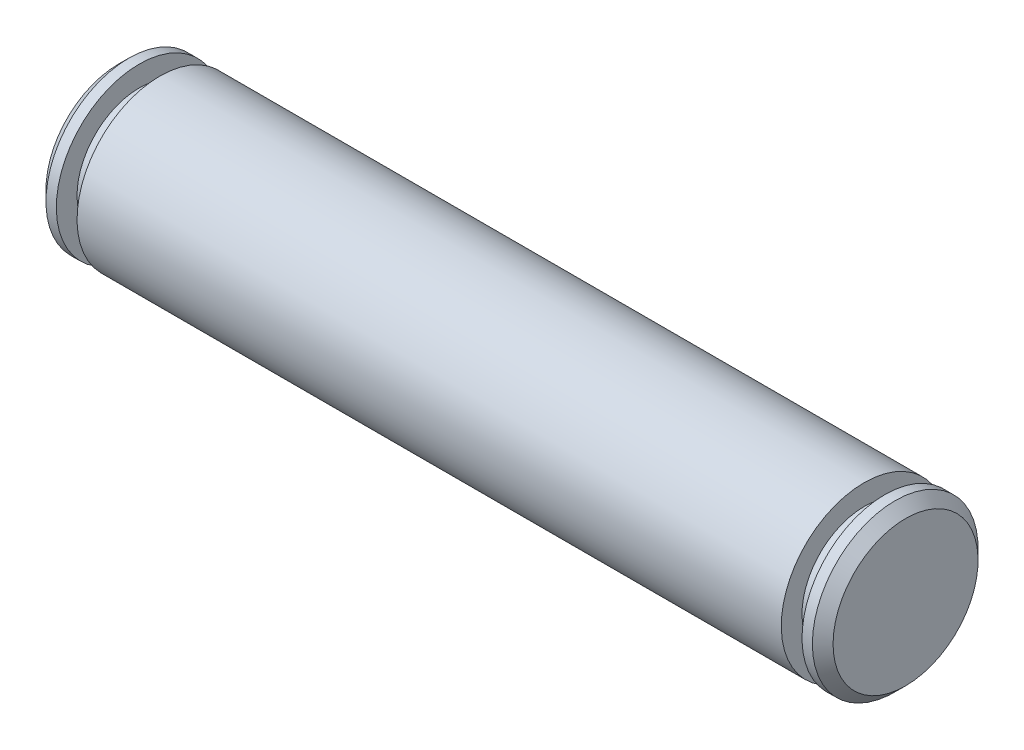
ISO-10303-21;
HEADER;
FILE_DESCRIPTION(('STEP AP214'),'2;1');
FILE_NAME('part.step','',(''),(''),'','','');
FILE_SCHEMA(('AUTOMOTIVE_DESIGN { 1 0 10303 214 1 1 1 1 }'));
ENDSEC;
DATA;
#1=APPLICATION_CONTEXT('core data for automotive mechanical design processes');
#2=APPLICATION_PROTOCOL_DEFINITION('international standard','automotive_design',2000,#1);
#3=PRODUCT_CONTEXT('',#1,'mechanical');
#4=PRODUCT('Part','Part','',(#3));
#5=PRODUCT_RELATED_PRODUCT_CATEGORY('part','',(#4));
#6=PRODUCT_DEFINITION_FORMATION('','',#4);
#7=PRODUCT_DEFINITION_CONTEXT('part definition',#1,'design');
#8=PRODUCT_DEFINITION('design','',#6,#7);
#9=PRODUCT_DEFINITION_SHAPE('','',#8);
#10=(LENGTH_UNIT() NAMED_UNIT(*) SI_UNIT(.MILLI.,.METRE.));
#11=(NAMED_UNIT(*) PLANE_ANGLE_UNIT() SI_UNIT($,.RADIAN.));
#12=(NAMED_UNIT(*) SI_UNIT($,.STERADIAN.) SOLID_ANGLE_UNIT());
#13=UNCERTAINTY_MEASURE_WITH_UNIT(LENGTH_MEASURE(1.E-05),#10,'distance_accuracy_value','');
#14=(GEOMETRIC_REPRESENTATION_CONTEXT(3) GLOBAL_UNCERTAINTY_ASSIGNED_CONTEXT((#13)) GLOBAL_UNIT_ASSIGNED_CONTEXT((#10,
#11,#12)) REPRESENTATION_CONTEXT('',''));
#15=CARTESIAN_POINT('',(0.,0.,0.));
#16=DIRECTION('',(0.,0.,1.));
#17=DIRECTION('',(1.,0.,0.));
#18=AXIS2_PLACEMENT_3D('',#15,#16,#17);
#19=CARTESIAN_POINT('',(0.,4.,0.));
#20=DIRECTION('',(1.,0.,0.));
#21=DIRECTION('',(0.,1.,0.));
#22=AXIS2_PLACEMENT_3D('',#19,#20,#21);
#23=PLANE('',#22);
#24=CARTESIAN_POINT('',(0.,4.,0.));
#25=DIRECTION('',(1.,0.,0.));
#26=DIRECTION('',(0.,1.,0.));
#27=AXIS2_PLACEMENT_3D('',#24,#25,#26);
#28=CIRCLE('',#27,3.49999999999999);
#29=CARTESIAN_POINT('',(0.,7.49999999999999,0.));
#30=VERTEX_POINT('',#29);
#31=EDGE_CURVE('E10',#30,#30,#28,.F.);
#32=ORIENTED_EDGE('',*,*,#31,.T.);
#33=EDGE_LOOP('',(#32));
#34=FACE_BOUND('',#33,.T.);
#35=ADVANCED_FACE('F29',(#34),#23,.F.);
#36=CARTESIAN_POINT('',(38.,4.00000000000001,0.));
#37=DIRECTION('',(1.,0.,0.));
#38=DIRECTION('',(0.,1.,0.));
#39=AXIS2_PLACEMENT_3D('',#36,#37,#38);
#40=CYLINDRICAL_SURFACE('',#39,4.);
#41=CARTESIAN_POINT('',(0.500000000000002,4.,0.));
#42=DIRECTION('',(1.,0.,0.));
#43=DIRECTION('',(0.,0.,-1.));
#44=AXIS2_PLACEMENT_3D('',#41,#42,#43);
#45=CIRCLE('',#44,4.);
#46=CARTESIAN_POINT('',(0.500000000000002,4.,-4.));
#47=VERTEX_POINT('',#46);
#48=EDGE_CURVE('E35',#47,#47,#45,.T.);
#49=ORIENTED_EDGE('',*,*,#48,.T.);
#50=EDGE_LOOP('',(#49));
#51=FACE_BOUND('',#50,.T.);
#52=CARTESIAN_POINT('',(1.,4.,0.));
#53=DIRECTION('',(1.,0.,0.));
#54=DIRECTION('',(0.,1.,0.));
#55=AXIS2_PLACEMENT_3D('',#52,#53,#54);
#56=CIRCLE('',#55,4.);
#57=CARTESIAN_POINT('',(1.,8.,0.));
#58=VERTEX_POINT('',#57);
#59=EDGE_CURVE('E48',#58,#58,#56,.T.);
#60=ORIENTED_EDGE('',*,*,#59,.F.);
#61=EDGE_LOOP('',(#60));
#62=FACE_BOUND('',#61,.T.);
#63=ADVANCED_FACE('F114',(#51,#62),#40,.T.);
#64=CARTESIAN_POINT('',(1.,0.,0.));
#65=DIRECTION('',(-1.,0.,0.));
#66=DIRECTION('',(0.,-1.,0.));
#67=AXIS2_PLACEMENT_3D('',#64,#65,#66);
#68=PLANE('',#67);
#69=CARTESIAN_POINT('',(1.,4.,0.));
#70=DIRECTION('',(1.,0.,0.));
#71=DIRECTION('',(0.,1.,0.));
#72=AXIS2_PLACEMENT_3D('',#69,#70,#71);
#73=CIRCLE('',#72,3.);
#74=CARTESIAN_POINT('',(1.,7.,0.));
#75=VERTEX_POINT('',#74);
#76=EDGE_CURVE('E51',#75,#75,#73,.T.);
#77=ORIENTED_EDGE('',*,*,#76,.F.);
#78=EDGE_LOOP('',(#77));
#79=FACE_BOUND('',#78,.T.);
#80=ORIENTED_EDGE('',*,*,#59,.T.);
#81=EDGE_LOOP('',(#80));
#82=FACE_BOUND('',#81,.T.);
#83=ADVANCED_FACE('F108',(#79,#82),#68,.F.);
#84=CARTESIAN_POINT('',(38.,4.00000000000001,0.));
#85=DIRECTION('',(1.,0.,0.));
#86=DIRECTION('',(0.,1.,0.));
#87=AXIS2_PLACEMENT_3D('',#84,#85,#86);
#88=CYLINDRICAL_SURFACE('',#87,3.);
#89=CARTESIAN_POINT('',(2.,4.,0.));
#90=DIRECTION('',(1.,0.,0.));
#91=DIRECTION('',(0.,1.,0.));
#92=AXIS2_PLACEMENT_3D('',#89,#90,#91);
#93=CIRCLE('',#92,3.);
#94=CARTESIAN_POINT('',(2.,7.,0.));
#95=VERTEX_POINT('',#94);
#96=EDGE_CURVE('E54',#95,#95,#93,.T.);
#97=ORIENTED_EDGE('',*,*,#96,.F.);
#98=EDGE_LOOP('',(#97));
#99=FACE_BOUND('',#98,.T.);
#100=ORIENTED_EDGE('',*,*,#76,.T.);
#101=EDGE_LOOP('',(#100));
#102=FACE_BOUND('',#101,.T.);
#103=ADVANCED_FACE('F102',(#99,#102),#88,.T.);
#104=CARTESIAN_POINT('',(2.,1.,0.));
#105=DIRECTION('',(1.,0.,0.));
#106=DIRECTION('',(0.,1.,0.));
#107=AXIS2_PLACEMENT_3D('',#104,#105,#106);
#108=PLANE('',#107);
#109=CARTESIAN_POINT('',(2.,4.,0.));
#110=DIRECTION('',(1.,0.,0.));
#111=DIRECTION('',(0.,1.,0.));
#112=AXIS2_PLACEMENT_3D('',#109,#110,#111);
#113=CIRCLE('',#112,4.);
#114=CARTESIAN_POINT('',(2.,8.,0.));
#115=VERTEX_POINT('',#114);
#116=EDGE_CURVE('E57',#115,#115,#113,.T.);
#117=ORIENTED_EDGE('',*,*,#116,.F.);
#118=EDGE_LOOP('',(#117));
#119=FACE_BOUND('',#118,.T.);
#120=ORIENTED_EDGE('',*,*,#96,.T.);
#121=EDGE_LOOP('',(#120));
#122=FACE_BOUND('',#121,.T.);
#123=ADVANCED_FACE('F96',(#119,#122),#108,.F.);
#124=CARTESIAN_POINT('',(38.,4.00000000000001,0.));
#125=DIRECTION('',(1.,0.,0.));
#126=DIRECTION('',(0.,1.,0.));
#127=AXIS2_PLACEMENT_3D('',#124,#125,#126);
#128=CYLINDRICAL_SURFACE('',#127,4.);
#129=CARTESIAN_POINT('',(36.,4.00000000000001,0.));
#130=DIRECTION('',(1.,0.,0.));
#131=DIRECTION('',(0.,1.,0.));
#132=AXIS2_PLACEMENT_3D('',#129,#130,#131);
#133=CIRCLE('',#132,4.);
#134=CARTESIAN_POINT('',(36.,8.00000000000001,0.));
#135=VERTEX_POINT('',#134);
#136=EDGE_CURVE('E60',#135,#135,#133,.T.);
#137=ORIENTED_EDGE('',*,*,#136,.F.);
#138=EDGE_LOOP('',(#137));
#139=FACE_BOUND('',#138,.T.);
#140=ORIENTED_EDGE('',*,*,#116,.T.);
#141=EDGE_LOOP('',(#140));
#142=FACE_BOUND('',#141,.T.);
#143=ADVANCED_FACE('F90',(#139,#142),#128,.T.);
#144=CARTESIAN_POINT('',(36.,0.,0.));
#145=DIRECTION('',(-1.,0.,0.));
#146=DIRECTION('',(0.,-1.,0.));
#147=AXIS2_PLACEMENT_3D('',#144,#145,#146);
#148=PLANE('',#147);
#149=CARTESIAN_POINT('',(36.,4.00000000000001,0.));
#150=DIRECTION('',(1.,0.,0.));
#151=DIRECTION('',(0.,1.,0.));
#152=AXIS2_PLACEMENT_3D('',#149,#150,#151);
#153=CIRCLE('',#152,3.);
#154=CARTESIAN_POINT('',(36.,7.00000000000001,0.));
#155=VERTEX_POINT('',#154);
#156=EDGE_CURVE('E63',#155,#155,#153,.T.);
#157=ORIENTED_EDGE('',*,*,#156,.F.);
#158=EDGE_LOOP('',(#157));
#159=FACE_BOUND('',#158,.T.);
#160=ORIENTED_EDGE('',*,*,#136,.T.);
#161=EDGE_LOOP('',(#160));
#162=FACE_BOUND('',#161,.T.);
#163=ADVANCED_FACE('F84',(#159,#162),#148,.F.);
#164=CARTESIAN_POINT('',(38.,4.00000000000001,0.));
#165=DIRECTION('',(1.,0.,0.));
#166=DIRECTION('',(0.,1.,0.));
#167=AXIS2_PLACEMENT_3D('',#164,#165,#166);
#168=CYLINDRICAL_SURFACE('',#167,3.);
#169=CARTESIAN_POINT('',(37.,4.00000000000001,0.));
#170=DIRECTION('',(1.,0.,0.));
#171=DIRECTION('',(0.,1.,0.));
#172=AXIS2_PLACEMENT_3D('',#169,#170,#171);
#173=CIRCLE('',#172,3.);
#174=CARTESIAN_POINT('',(37.,7.00000000000001,0.));
#175=VERTEX_POINT('',#174);
#176=EDGE_CURVE('E66',#175,#175,#173,.T.);
#177=ORIENTED_EDGE('',*,*,#176,.F.);
#178=EDGE_LOOP('',(#177));
#179=FACE_BOUND('',#178,.T.);
#180=ORIENTED_EDGE('',*,*,#156,.T.);
#181=EDGE_LOOP('',(#180));
#182=FACE_BOUND('',#181,.T.);
#183=ADVANCED_FACE('F78',(#179,#182),#168,.T.);
#184=CARTESIAN_POINT('',(37.,1.,0.));
#185=DIRECTION('',(1.,0.,0.));
#186=DIRECTION('',(0.,1.,0.));
#187=AXIS2_PLACEMENT_3D('',#184,#185,#186);
#188=PLANE('',#187);
#189=CARTESIAN_POINT('',(37.,4.00000000000001,0.));
#190=DIRECTION('',(1.,0.,0.));
#191=DIRECTION('',(0.,1.,0.));
#192=AXIS2_PLACEMENT_3D('',#189,#190,#191);
#193=CIRCLE('',#192,4.);
#194=CARTESIAN_POINT('',(37.,8.00000000000001,0.));
#195=VERTEX_POINT('',#194);
#196=EDGE_CURVE('E69',#195,#195,#193,.T.);
#197=ORIENTED_EDGE('',*,*,#196,.F.);
#198=EDGE_LOOP('',(#197));
#199=FACE_BOUND('',#198,.T.);
#200=ORIENTED_EDGE('',*,*,#176,.T.);
#201=EDGE_LOOP('',(#200));
#202=FACE_BOUND('',#201,.T.);
#203=ADVANCED_FACE('F75',(#199,#202),#188,.F.);
#204=CARTESIAN_POINT('',(38.,4.00000000000001,0.));
#205=DIRECTION('',(1.,0.,0.));
#206=DIRECTION('',(0.,1.,0.));
#207=AXIS2_PLACEMENT_3D('',#204,#205,#206);
#208=CYLINDRICAL_SURFACE('',#207,4.);
#209=CARTESIAN_POINT('',(37.5,4.00000000000001,0.));
#210=DIRECTION('',(-1.,0.,0.));
#211=DIRECTION('',(0.,0.,1.));
#212=AXIS2_PLACEMENT_3D('',#209,#210,#211);
#213=CIRCLE('',#212,4.);
#214=CARTESIAN_POINT('',(37.5,4.00000000000001,4.));
#215=VERTEX_POINT('',#214);
#216=EDGE_CURVE('E39',#215,#215,#213,.T.);
#217=ORIENTED_EDGE('',*,*,#216,.T.);
#218=EDGE_LOOP('',(#217));
#219=FACE_BOUND('',#218,.T.);
#220=ORIENTED_EDGE('',*,*,#196,.T.);
#221=EDGE_LOOP('',(#220));
#222=FACE_BOUND('',#221,.T.);
#223=ADVANCED_FACE('F73',(#219,#222),#208,.T.);
#224=CARTESIAN_POINT('',(38.,0.,0.));
#225=DIRECTION('',(-1.,0.,0.));
#226=DIRECTION('',(0.,-1.,0.));
#227=AXIS2_PLACEMENT_3D('',#224,#225,#226);
#228=PLANE('',#227);
#229=CARTESIAN_POINT('',(38.,4.00000000000001,0.));
#230=DIRECTION('',(-1.,0.,0.));
#231=DIRECTION('',(0.,-1.,0.));
#232=AXIS2_PLACEMENT_3D('',#229,#230,#231);
#233=CIRCLE('',#232,3.5);
#234=CARTESIAN_POINT('',(38.,0.500000000000004,0.));
#235=VERTEX_POINT('',#234);
#236=EDGE_CURVE('E43',#235,#235,#233,.F.);
#237=ORIENTED_EDGE('',*,*,#236,.T.);
#238=EDGE_LOOP('',(#237));
#239=FACE_BOUND('',#238,.T.);
#240=ADVANCED_FACE('F125',(#239),#228,.F.);
#241=CARTESIAN_POINT('',(38.,4.00000000000001,0.));
#242=DIRECTION('',(-1.,0.,0.));
#243=DIRECTION('',(0.,0.,1.));
#244=AXIS2_PLACEMENT_3D('',#241,#242,#243);
#245=CONICAL_SURFACE('',#244,3.5,0.785398163397448);
#246=ORIENTED_EDGE('',*,*,#216,.F.);
#247=EDGE_LOOP('',(#246));
#248=FACE_BOUND('',#247,.T.);
#249=ORIENTED_EDGE('',*,*,#236,.F.);
#250=EDGE_LOOP('',(#249));
#251=FACE_BOUND('',#250,.T.);
#252=ADVANCED_FACE('F129',(#248,#251),#245,.T.);
#253=CARTESIAN_POINT('',(0.500000000000002,4.,0.));
#254=DIRECTION('',(1.,0.,0.));
#255=DIRECTION('',(0.,0.,-1.));
#256=AXIS2_PLACEMENT_3D('',#253,#254,#255);
#257=CONICAL_SURFACE('',#256,4.,0.78539816339745);
#258=ORIENTED_EDGE('',*,*,#31,.F.);
#259=EDGE_LOOP('',(#258));
#260=FACE_BOUND('',#259,.T.);
#261=ORIENTED_EDGE('',*,*,#48,.F.);
#262=EDGE_LOOP('',(#261));
#263=FACE_BOUND('',#262,.T.);
#264=ADVANCED_FACE('F133',(#260,#263),#257,.T.);
#265=CLOSED_SHELL('',(#35,#63,#83,#103,#123,#143,#163,#183,#203,#223,#240,#252,#264));
#266=MANIFOLD_SOLID_BREP('B2',#265);
#267=ADVANCED_BREP_SHAPE_REPRESENTATION('',(#18,#266),#14);
#268=SHAPE_DEFINITION_REPRESENTATION(#9,#267);
ENDSEC;
END-ISO-10303-21;
